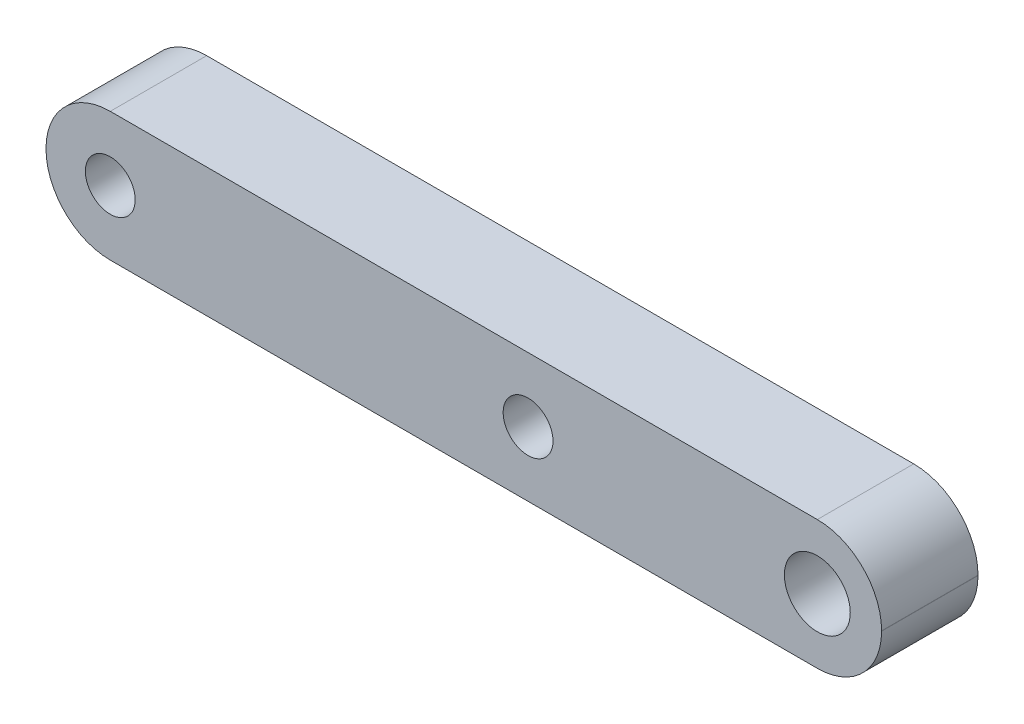
ISO-10303-21;
HEADER;
FILE_DESCRIPTION(('STEP AP214'),'2;1');
FILE_NAME('part.step','',(''),(''),'','','');
FILE_SCHEMA(('AUTOMOTIVE_DESIGN { 1 0 10303 214 1 1 1 1 }'));
ENDSEC;
DATA;
#1=APPLICATION_CONTEXT('core data for automotive mechanical design processes');
#2=APPLICATION_PROTOCOL_DEFINITION('international standard','automotive_design',2000,#1);
#3=PRODUCT_CONTEXT('',#1,'mechanical');
#4=PRODUCT('Part','Part','',(#3));
#5=PRODUCT_RELATED_PRODUCT_CATEGORY('part','',(#4));
#6=PRODUCT_DEFINITION_FORMATION('','',#4);
#7=PRODUCT_DEFINITION_CONTEXT('part definition',#1,'design');
#8=PRODUCT_DEFINITION('design','',#6,#7);
#9=PRODUCT_DEFINITION_SHAPE('','',#8);
#10=(LENGTH_UNIT() NAMED_UNIT(*) SI_UNIT(.MILLI.,.METRE.));
#11=(NAMED_UNIT(*) PLANE_ANGLE_UNIT() SI_UNIT($,.RADIAN.));
#12=(NAMED_UNIT(*) SI_UNIT($,.STERADIAN.) SOLID_ANGLE_UNIT());
#13=UNCERTAINTY_MEASURE_WITH_UNIT(LENGTH_MEASURE(1.E-05),#10,'distance_accuracy_value','');
#14=(GEOMETRIC_REPRESENTATION_CONTEXT(3) GLOBAL_UNCERTAINTY_ASSIGNED_CONTEXT((#13)) GLOBAL_UNIT_ASSIGNED_CONTEXT((#10,
#11,#12)) REPRESENTATION_CONTEXT('',''));
#15=CARTESIAN_POINT('',(0.,0.,0.));
#16=DIRECTION('',(0.,0.,1.));
#17=DIRECTION('',(1.,0.,0.));
#18=AXIS2_PLACEMENT_3D('',#15,#16,#17);
#19=CARTESIAN_POINT('',(196.389986738014,90.1843117146729,6.));
#20=DIRECTION('',(0.,0.,-1.));
#21=DIRECTION('',(-1.,0.,0.));
#22=AXIS2_PLACEMENT_3D('',#19,#20,#21);
#23=CYLINDRICAL_SURFACE('',#22,4.);
#24=CARTESIAN_POINT('',(196.389986738014,90.1843117146729,0.));
#25=DIRECTION('',(0.,0.,1.));
#26=DIRECTION('',(1.,0.,0.));
#27=AXIS2_PLACEMENT_3D('',#24,#25,#26);
#28=CIRCLE('',#27,4.);
#29=CARTESIAN_POINT('',(196.389986738014,86.1843117146728,0.));
#30=VERTEX_POINT('',#29);
#31=CARTESIAN_POINT('',(200.389986738014,90.1843117146729,0.));
#32=VERTEX_POINT('',#31);
#33=EDGE_CURVE('E131',#30,#32,#28,.T.);
#34=ORIENTED_EDGE('',*,*,#33,.T.);
#35=DIRECTION('',(0.,0.,-1.));
#36=VECTOR('',#35,1.);
#37=CARTESIAN_POINT('',(200.389986738014,90.1843117146729,6.));
#38=LINE('',#37,#36);
#39=CARTESIAN_POINT('',(200.389986738014,90.1843117146729,6.));
#40=VERTEX_POINT('',#39);
#41=EDGE_CURVE('E11',#40,#32,#38,.T.);
#42=ORIENTED_EDGE('',*,*,#41,.F.);
#43=CARTESIAN_POINT('',(196.389986738014,90.1843117146729,6.));
#44=DIRECTION('',(0.,0.,1.));
#45=DIRECTION('',(1.,0.,0.));
#46=AXIS2_PLACEMENT_3D('',#43,#44,#45);
#47=CIRCLE('',#46,4.);
#48=CARTESIAN_POINT('',(196.389986738014,86.1843117146728,6.));
#49=VERTEX_POINT('',#48);
#50=EDGE_CURVE('E146',#49,#40,#47,.T.);
#51=ORIENTED_EDGE('',*,*,#50,.F.);
#52=DIRECTION('',(0.,0.,-1.));
#53=VECTOR('',#52,1.);
#54=CARTESIAN_POINT('',(196.389986738014,86.1843117146728,6.));
#55=LINE('',#54,#53);
#56=EDGE_CURVE('E127',#49,#30,#55,.T.);
#57=ORIENTED_EDGE('',*,*,#56,.T.);
#58=EDGE_LOOP('',(#34,#42,#51,#57));
#59=FACE_BOUND('',#58,.T.);
#60=ADVANCED_FACE('F35',(#59),#23,.T.);
#61=CARTESIAN_POINT('',(200.389986738014,90.2043117146728,6.));
#62=DIRECTION('',(-1.,0.,0.));
#63=DIRECTION('',(0.,0.,1.));
#64=AXIS2_PLACEMENT_3D('',#61,#62,#63);
#65=PLANE('',#64);
#66=DIRECTION('',(0.,1.,0.));
#67=VECTOR('',#66,1.);
#68=CARTESIAN_POINT('',(200.389986738014,90.2043117146728,0.));
#69=LINE('',#68,#67);
#70=CARTESIAN_POINT('',(200.389986738014,90.2043117146728,0.));
#71=VERTEX_POINT('',#70);
#72=EDGE_CURVE('E134',#32,#71,#69,.T.);
#73=ORIENTED_EDGE('',*,*,#72,.T.);
#74=DIRECTION('',(0.,0.,-1.));
#75=VECTOR('',#74,1.);
#76=CARTESIAN_POINT('',(200.389986738014,90.2043117146728,6.));
#77=LINE('',#76,#75);
#78=CARTESIAN_POINT('',(200.389986738014,90.2043117146728,6.));
#79=VERTEX_POINT('',#78);
#80=EDGE_CURVE('E43',#79,#71,#77,.T.);
#81=ORIENTED_EDGE('',*,*,#80,.F.);
#82=DIRECTION('',(0.,1.,0.));
#83=VECTOR('',#82,1.);
#84=CARTESIAN_POINT('',(200.389986738014,90.2043117146728,6.));
#85=LINE('',#84,#83);
#86=EDGE_CURVE('E94',#40,#79,#85,.T.);
#87=ORIENTED_EDGE('',*,*,#86,.F.);
#88=ORIENTED_EDGE('',*,*,#41,.T.);
#89=EDGE_LOOP('',(#73,#81,#87,#88));
#90=FACE_BOUND('',#89,.T.);
#91=ADVANCED_FACE('F227',(#90),#65,.F.);
#92=CARTESIAN_POINT('',(196.389986738014,90.2043117146728,6.));
#93=DIRECTION('',(0.,0.,-1.));
#94=DIRECTION('',(-1.,0.,0.));
#95=AXIS2_PLACEMENT_3D('',#92,#93,#94);
#96=CYLINDRICAL_SURFACE('',#95,4.);
#97=CARTESIAN_POINT('',(196.389986738014,90.2043117146728,0.));
#98=DIRECTION('',(0.,0.,1.));
#99=DIRECTION('',(-1.,0.,0.));
#100=AXIS2_PLACEMENT_3D('',#97,#98,#99);
#101=CIRCLE('',#100,4.);
#102=CARTESIAN_POINT('',(196.389986738014,94.2043117146728,0.));
#103=VERTEX_POINT('',#102);
#104=EDGE_CURVE('E137',#71,#103,#101,.T.);
#105=ORIENTED_EDGE('',*,*,#104,.T.);
#106=DIRECTION('',(0.,0.,-1.));
#107=VECTOR('',#106,1.);
#108=CARTESIAN_POINT('',(196.389986738014,94.2043117146728,6.));
#109=LINE('',#108,#107);
#110=CARTESIAN_POINT('',(196.389986738014,94.2043117146728,6.));
#111=VERTEX_POINT('',#110);
#112=EDGE_CURVE('E153',#111,#103,#109,.T.);
#113=ORIENTED_EDGE('',*,*,#112,.F.);
#114=CARTESIAN_POINT('',(196.389986738014,90.2043117146728,6.));
#115=DIRECTION('',(0.,0.,1.));
#116=DIRECTION('',(-1.,0.,0.));
#117=AXIS2_PLACEMENT_3D('',#114,#115,#116);
#118=CIRCLE('',#117,4.);
#119=EDGE_CURVE('E161',#79,#111,#118,.T.);
#120=ORIENTED_EDGE('',*,*,#119,.F.);
#121=ORIENTED_EDGE('',*,*,#80,.T.);
#122=EDGE_LOOP('',(#105,#113,#120,#121));
#123=FACE_BOUND('',#122,.T.);
#124=ADVANCED_FACE('F159',(#123),#96,.T.);
#125=CARTESIAN_POINT('',(152.389986738014,94.2043117146728,6.));
#126=DIRECTION('',(0.,-1.,0.));
#127=DIRECTION('',(0.,0.,-1.));
#128=AXIS2_PLACEMENT_3D('',#125,#126,#127);
#129=PLANE('',#128);
#130=DIRECTION('',(-1.,0.,0.));
#131=VECTOR('',#130,1.);
#132=CARTESIAN_POINT('',(152.389986738014,94.2043117146728,0.));
#133=LINE('',#132,#131);
#134=CARTESIAN_POINT('',(152.389986738014,94.2043117146728,0.));
#135=VERTEX_POINT('',#134);
#136=EDGE_CURVE('E139',#103,#135,#133,.T.);
#137=ORIENTED_EDGE('',*,*,#136,.T.);
#138=DIRECTION('',(0.,0.,-1.));
#139=VECTOR('',#138,1.);
#140=CARTESIAN_POINT('',(152.389986738014,94.2043117146728,6.));
#141=LINE('',#140,#139);
#142=CARTESIAN_POINT('',(152.389986738014,94.2043117146728,6.));
#143=VERTEX_POINT('',#142);
#144=EDGE_CURVE('E150',#143,#135,#141,.T.);
#145=ORIENTED_EDGE('',*,*,#144,.F.);
#146=DIRECTION('',(-1.,0.,0.));
#147=VECTOR('',#146,1.);
#148=CARTESIAN_POINT('',(152.389986738014,94.2043117146728,6.));
#149=LINE('',#148,#147);
#150=EDGE_CURVE('E173',#111,#143,#149,.T.);
#151=ORIENTED_EDGE('',*,*,#150,.F.);
#152=ORIENTED_EDGE('',*,*,#112,.T.);
#153=EDGE_LOOP('',(#137,#145,#151,#152));
#154=FACE_BOUND('',#153,.T.);
#155=ADVANCED_FACE('F169',(#154),#129,.F.);
#156=CARTESIAN_POINT('',(152.389986738014,90.2043117146728,6.));
#157=DIRECTION('',(0.,0.,-1.));
#158=DIRECTION('',(-1.,0.,0.));
#159=AXIS2_PLACEMENT_3D('',#156,#157,#158);
#160=CYLINDRICAL_SURFACE('',#159,4.);
#161=CARTESIAN_POINT('',(152.389986738014,90.2043117146728,0.));
#162=DIRECTION('',(0.,0.,1.));
#163=DIRECTION('',(1.,0.,0.));
#164=AXIS2_PLACEMENT_3D('',#161,#162,#163);
#165=CIRCLE('',#164,4.);
#166=CARTESIAN_POINT('',(148.389986738014,90.2043117146728,0.));
#167=VERTEX_POINT('',#166);
#168=EDGE_CURVE('E141',#135,#167,#165,.T.);
#169=ORIENTED_EDGE('',*,*,#168,.T.);
#170=DIRECTION('',(0.,0.,-1.));
#171=VECTOR('',#170,1.);
#172=CARTESIAN_POINT('',(148.389986738014,90.2043117146728,6.));
#173=LINE('',#172,#171);
#174=CARTESIAN_POINT('',(148.389986738014,90.2043117146728,6.));
#175=VERTEX_POINT('',#174);
#176=EDGE_CURVE('E122',#175,#167,#173,.T.);
#177=ORIENTED_EDGE('',*,*,#176,.F.);
#178=CARTESIAN_POINT('',(152.389986738014,90.2043117146728,6.));
#179=DIRECTION('',(0.,0.,1.));
#180=DIRECTION('',(1.,0.,0.));
#181=AXIS2_PLACEMENT_3D('',#178,#179,#180);
#182=CIRCLE('',#181,4.);
#183=EDGE_CURVE('E113',#143,#175,#182,.T.);
#184=ORIENTED_EDGE('',*,*,#183,.F.);
#185=ORIENTED_EDGE('',*,*,#144,.T.);
#186=EDGE_LOOP('',(#169,#177,#184,#185));
#187=FACE_BOUND('',#186,.T.);
#188=ADVANCED_FACE('F172',(#187),#160,.T.);
#189=CARTESIAN_POINT('',(148.389986738014,90.2043117146728,6.));
#190=DIRECTION('',(1.,0.,0.));
#191=DIRECTION('',(0.,0.,-1.));
#192=AXIS2_PLACEMENT_3D('',#189,#190,#191);
#193=PLANE('',#192);
#194=DIRECTION('',(0.,-1.,0.));
#195=VECTOR('',#194,1.);
#196=CARTESIAN_POINT('',(148.389986738014,90.2043117146728,0.));
#197=LINE('',#196,#195);
#198=CARTESIAN_POINT('',(148.389986738014,90.1843117146728,0.));
#199=VERTEX_POINT('',#198);
#200=EDGE_CURVE('E121',#167,#199,#197,.T.);
#201=ORIENTED_EDGE('',*,*,#200,.T.);
#202=DIRECTION('',(0.,0.,-1.));
#203=VECTOR('',#202,1.);
#204=CARTESIAN_POINT('',(148.389986738014,90.1843117146728,6.));
#205=LINE('',#204,#203);
#206=CARTESIAN_POINT('',(148.389986738014,90.1843117146728,6.));
#207=VERTEX_POINT('',#206);
#208=EDGE_CURVE('E118',#207,#199,#205,.T.);
#209=ORIENTED_EDGE('',*,*,#208,.F.);
#210=DIRECTION('',(0.,-1.,0.));
#211=VECTOR('',#210,1.);
#212=CARTESIAN_POINT('',(148.389986738014,90.2043117146728,6.));
#213=LINE('',#212,#211);
#214=EDGE_CURVE('E107',#175,#207,#213,.T.);
#215=ORIENTED_EDGE('',*,*,#214,.F.);
#216=ORIENTED_EDGE('',*,*,#176,.T.);
#217=EDGE_LOOP('',(#201,#209,#215,#216));
#218=FACE_BOUND('',#217,.T.);
#219=ADVANCED_FACE('F119',(#218),#193,.F.);
#220=CARTESIAN_POINT('',(152.389986738014,90.1843117146728,6.));
#221=DIRECTION('',(0.,0.,-1.));
#222=DIRECTION('',(-1.,0.,0.));
#223=AXIS2_PLACEMENT_3D('',#220,#221,#222);
#224=CYLINDRICAL_SURFACE('',#223,3.99999999999998);
#225=CARTESIAN_POINT('',(152.389986738014,90.1843117146728,0.));
#226=DIRECTION('',(0.,0.,1.));
#227=DIRECTION('',(1.,0.,0.));
#228=AXIS2_PLACEMENT_3D('',#225,#226,#227);
#229=CIRCLE('',#228,3.99999999999998);
#230=CARTESIAN_POINT('',(152.389986738014,86.1843117146728,0.));
#231=VERTEX_POINT('',#230);
#232=EDGE_CURVE('E80',#199,#231,#229,.T.);
#233=ORIENTED_EDGE('',*,*,#232,.T.);
#234=DIRECTION('',(0.,0.,-1.));
#235=VECTOR('',#234,1.);
#236=CARTESIAN_POINT('',(152.389986738014,86.1843117146728,6.));
#237=LINE('',#236,#235);
#238=CARTESIAN_POINT('',(152.389986738014,86.1843117146728,6.));
#239=VERTEX_POINT('',#238);
#240=EDGE_CURVE('E123',#239,#231,#237,.T.);
#241=ORIENTED_EDGE('',*,*,#240,.F.);
#242=CARTESIAN_POINT('',(152.389986738014,90.1843117146728,6.));
#243=DIRECTION('',(0.,0.,1.));
#244=DIRECTION('',(1.,0.,0.));
#245=AXIS2_PLACEMENT_3D('',#242,#243,#244);
#246=CIRCLE('',#245,3.99999999999998);
#247=EDGE_CURVE('E111',#207,#239,#246,.T.);
#248=ORIENTED_EDGE('',*,*,#247,.F.);
#249=ORIENTED_EDGE('',*,*,#208,.T.);
#250=EDGE_LOOP('',(#233,#241,#248,#249));
#251=FACE_BOUND('',#250,.T.);
#252=ADVANCED_FACE('F125',(#251),#224,.T.);
#253=CARTESIAN_POINT('',(152.389986738014,86.1843117146728,6.));
#254=DIRECTION('',(0.,1.,0.));
#255=DIRECTION('',(-1.,0.,0.));
#256=AXIS2_PLACEMENT_3D('',#253,#254,#255);
#257=PLANE('',#256);
#258=DIRECTION('',(1.,0.,0.));
#259=VECTOR('',#258,1.);
#260=CARTESIAN_POINT('',(152.389986738014,86.1843117146728,0.));
#261=LINE('',#260,#259);
#262=EDGE_CURVE('E86',#231,#30,#261,.T.);
#263=ORIENTED_EDGE('',*,*,#262,.T.);
#264=ORIENTED_EDGE('',*,*,#56,.F.);
#265=DIRECTION('',(1.,0.,0.));
#266=VECTOR('',#265,1.);
#267=CARTESIAN_POINT('',(152.389986738014,86.1843117146728,6.));
#268=LINE('',#267,#266);
#269=EDGE_CURVE('E51',#239,#49,#268,.T.);
#270=ORIENTED_EDGE('',*,*,#269,.F.);
#271=ORIENTED_EDGE('',*,*,#240,.T.);
#272=EDGE_LOOP('',(#263,#264,#270,#271));
#273=FACE_BOUND('',#272,.T.);
#274=ADVANCED_FACE('F208',(#273),#257,.F.);
#275=CARTESIAN_POINT('',(196.389986738014,90.1843117146729,6.));
#276=DIRECTION('',(0.,0.,1.));
#277=DIRECTION('',(1.,0.,0.));
#278=AXIS2_PLACEMENT_3D('',#275,#276,#277);
#279=PLANE('',#278);
#280=CARTESIAN_POINT('',(152.389986738014,90.2043117136981,6.));
#281=DIRECTION('',(0.,0.,1.));
#282=DIRECTION('',(1.,0.,0.));
#283=AXIS2_PLACEMENT_3D('',#280,#281,#282);
#284=CIRCLE('',#283,1.54999999999999);
#285=CARTESIAN_POINT('',(153.939986738014,90.2043117136981,6.));
#286=VERTEX_POINT('',#285);
#287=EDGE_CURVE('E191',#286,#286,#284,.T.);
#288=ORIENTED_EDGE('',*,*,#287,.F.);
#289=EDGE_LOOP('',(#288));
#290=FACE_BOUND('',#289,.T.);
#291=CARTESIAN_POINT('',(178.389986738014,90.2043117136963,6.));
#292=DIRECTION('',(0.,0.,1.));
#293=DIRECTION('',(1.,0.,0.));
#294=AXIS2_PLACEMENT_3D('',#291,#292,#293);
#295=CIRCLE('',#294,1.54999999999999);
#296=CARTESIAN_POINT('',(179.939986738014,90.2043117136963,6.));
#297=VERTEX_POINT('',#296);
#298=EDGE_CURVE('E185',#297,#297,#295,.T.);
#299=ORIENTED_EDGE('',*,*,#298,.F.);
#300=EDGE_LOOP('',(#299));
#301=FACE_BOUND('',#300,.T.);
#302=CARTESIAN_POINT('',(196.389986738014,90.204311713695,6.));
#303=DIRECTION('',(0.,0.,1.));
#304=DIRECTION('',(1.,0.,0.));
#305=AXIS2_PLACEMENT_3D('',#302,#303,#304);
#306=CIRCLE('',#305,2.04999999999999);
#307=CARTESIAN_POINT('',(198.439986738014,90.204311713695,6.));
#308=VERTEX_POINT('',#307);
#309=EDGE_CURVE('E179',#308,#308,#306,.T.);
#310=ORIENTED_EDGE('',*,*,#309,.F.);
#311=EDGE_LOOP('',(#310));
#312=FACE_BOUND('',#311,.T.);
#313=ORIENTED_EDGE('',*,*,#50,.T.);
#314=ORIENTED_EDGE('',*,*,#86,.T.);
#315=ORIENTED_EDGE('',*,*,#119,.T.);
#316=ORIENTED_EDGE('',*,*,#150,.T.);
#317=ORIENTED_EDGE('',*,*,#183,.T.);
#318=ORIENTED_EDGE('',*,*,#214,.T.);
#319=ORIENTED_EDGE('',*,*,#247,.T.);
#320=ORIENTED_EDGE('',*,*,#269,.T.);
#321=EDGE_LOOP('',(#313,#314,#315,#316,#317,#318,#319,#320));
#322=FACE_BOUND('',#321,.T.);
#323=ADVANCED_FACE('F109',(#290,#301,#312,#322),#279,.T.);
#324=CARTESIAN_POINT('',(196.389986738014,90.1843117146729,0.));
#325=DIRECTION('',(0.,0.,1.));
#326=DIRECTION('',(1.,0.,0.));
#327=AXIS2_PLACEMENT_3D('',#324,#325,#326);
#328=PLANE('',#327);
#329=CARTESIAN_POINT('',(152.389986738014,90.2043117136981,0.));
#330=DIRECTION('',(0.,0.,1.));
#331=DIRECTION('',(1.,0.,0.));
#332=AXIS2_PLACEMENT_3D('',#329,#330,#331);
#333=CIRCLE('',#332,1.54999999999999);
#334=CARTESIAN_POINT('',(153.939986738014,90.2043117136981,0.));
#335=VERTEX_POINT('',#334);
#336=EDGE_CURVE('E188',#335,#335,#333,.T.);
#337=ORIENTED_EDGE('',*,*,#336,.T.);
#338=EDGE_LOOP('',(#337));
#339=FACE_BOUND('',#338,.T.);
#340=CARTESIAN_POINT('',(178.389986738014,90.2043117136963,0.));
#341=DIRECTION('',(0.,0.,1.));
#342=DIRECTION('',(1.,0.,0.));
#343=AXIS2_PLACEMENT_3D('',#340,#341,#342);
#344=CIRCLE('',#343,1.54999999999999);
#345=CARTESIAN_POINT('',(179.939986738014,90.2043117136963,0.));
#346=VERTEX_POINT('',#345);
#347=EDGE_CURVE('E182',#346,#346,#344,.T.);
#348=ORIENTED_EDGE('',*,*,#347,.T.);
#349=EDGE_LOOP('',(#348));
#350=FACE_BOUND('',#349,.T.);
#351=CARTESIAN_POINT('',(196.389986738014,90.204311713695,0.));
#352=DIRECTION('',(0.,0.,1.));
#353=DIRECTION('',(1.,0.,0.));
#354=AXIS2_PLACEMENT_3D('',#351,#352,#353);
#355=CIRCLE('',#354,2.04999999999999);
#356=CARTESIAN_POINT('',(198.439986738014,90.204311713695,0.));
#357=VERTEX_POINT('',#356);
#358=EDGE_CURVE('E135',#357,#357,#355,.T.);
#359=ORIENTED_EDGE('',*,*,#358,.T.);
#360=EDGE_LOOP('',(#359));
#361=FACE_BOUND('',#360,.T.);
#362=ORIENTED_EDGE('',*,*,#33,.F.);
#363=ORIENTED_EDGE('',*,*,#262,.F.);
#364=ORIENTED_EDGE('',*,*,#232,.F.);
#365=ORIENTED_EDGE('',*,*,#200,.F.);
#366=ORIENTED_EDGE('',*,*,#168,.F.);
#367=ORIENTED_EDGE('',*,*,#136,.F.);
#368=ORIENTED_EDGE('',*,*,#104,.F.);
#369=ORIENTED_EDGE('',*,*,#72,.F.);
#370=EDGE_LOOP('',(#362,#363,#364,#365,#366,#367,#368,#369));
#371=FACE_BOUND('',#370,.T.);
#372=ADVANCED_FACE('F165',(#339,#350,#361,#371),#328,.F.);
#373=CARTESIAN_POINT('',(196.389986738014,90.204311713695,0.));
#374=DIRECTION('',(0.,0.,1.));
#375=DIRECTION('',(1.,0.,0.));
#376=AXIS2_PLACEMENT_3D('',#373,#374,#375);
#377=CYLINDRICAL_SURFACE('',#376,2.04999999999999);
#378=ORIENTED_EDGE('',*,*,#358,.F.);
#379=EDGE_LOOP('',(#378));
#380=FACE_BOUND('',#379,.T.);
#381=ORIENTED_EDGE('',*,*,#309,.T.);
#382=EDGE_LOOP('',(#381));
#383=FACE_BOUND('',#382,.T.);
#384=ADVANCED_FACE('F214',(#380,#383),#377,.F.);
#385=CARTESIAN_POINT('',(178.389986738014,90.2043117136963,0.));
#386=DIRECTION('',(0.,0.,1.));
#387=DIRECTION('',(1.,0.,0.));
#388=AXIS2_PLACEMENT_3D('',#385,#386,#387);
#389=CYLINDRICAL_SURFACE('',#388,1.54999999999999);
#390=ORIENTED_EDGE('',*,*,#347,.F.);
#391=EDGE_LOOP('',(#390));
#392=FACE_BOUND('',#391,.T.);
#393=ORIENTED_EDGE('',*,*,#298,.T.);
#394=EDGE_LOOP('',(#393));
#395=FACE_BOUND('',#394,.T.);
#396=ADVANCED_FACE('F202',(#392,#395),#389,.F.);
#397=CARTESIAN_POINT('',(152.389986738014,90.2043117136981,0.));
#398=DIRECTION('',(0.,0.,1.));
#399=DIRECTION('',(1.,0.,0.));
#400=AXIS2_PLACEMENT_3D('',#397,#398,#399);
#401=CYLINDRICAL_SURFACE('',#400,1.54999999999999);
#402=ORIENTED_EDGE('',*,*,#336,.F.);
#403=EDGE_LOOP('',(#402));
#404=FACE_BOUND('',#403,.T.);
#405=ORIENTED_EDGE('',*,*,#287,.T.);
#406=EDGE_LOOP('',(#405));
#407=FACE_BOUND('',#406,.T.);
#408=ADVANCED_FACE('F199',(#404,#407),#401,.F.);
#409=CLOSED_SHELL('',(#60,#91,#124,#155,#188,#219,#252,#274,#323,#372,#384,#396,#408));
#410=MANIFOLD_SOLID_BREP('B2',#409);
#411=ADVANCED_BREP_SHAPE_REPRESENTATION('',(#18,#410),#14);
#412=SHAPE_DEFINITION_REPRESENTATION(#9,#411);
ENDSEC;
END-ISO-10303-21;
